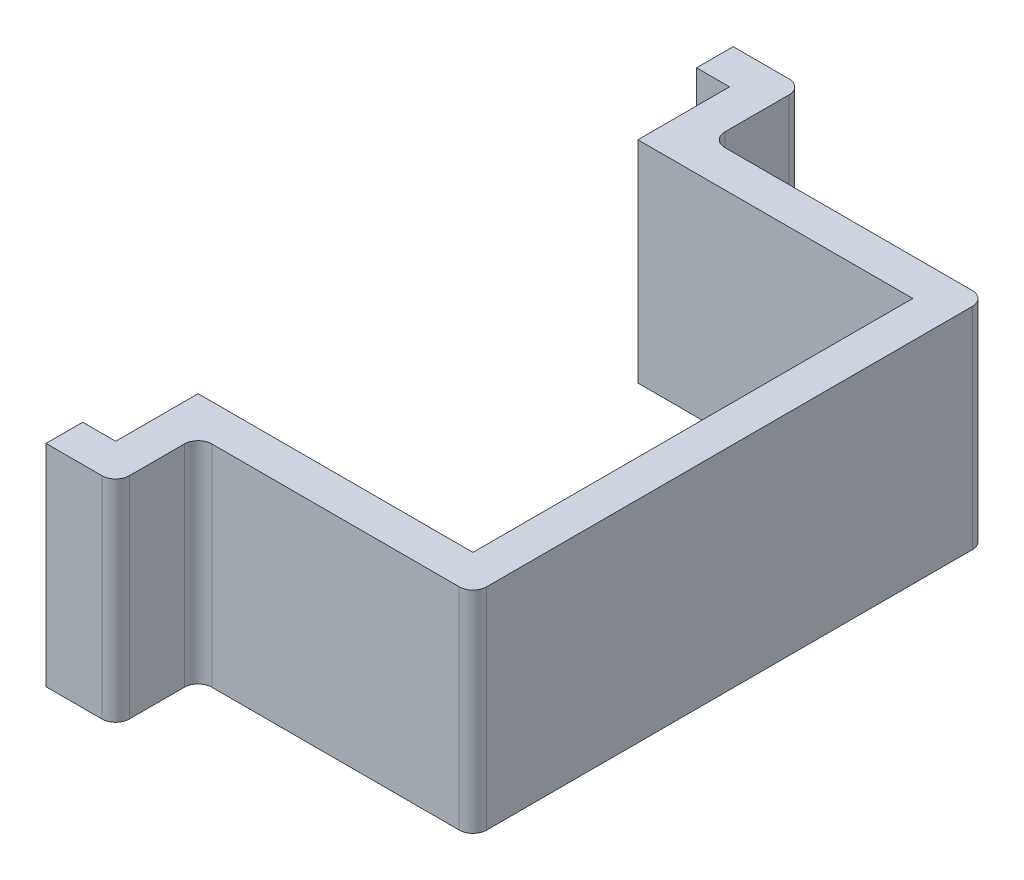
ISO-10303-21;
HEADER;
FILE_DESCRIPTION(('STEP AP214'),'2;1');
FILE_NAME('part.step','',(''),(''),'','','');
FILE_SCHEMA(('AUTOMOTIVE_DESIGN { 1 0 10303 214 1 1 1 1 }'));
ENDSEC;
DATA;
#1=APPLICATION_CONTEXT('core data for automotive mechanical design processes');
#2=APPLICATION_PROTOCOL_DEFINITION('international standard','automotive_design',2000,#1);
#3=PRODUCT_CONTEXT('',#1,'mechanical');
#4=PRODUCT('Part','Part','',(#3));
#5=PRODUCT_RELATED_PRODUCT_CATEGORY('part','',(#4));
#6=PRODUCT_DEFINITION_FORMATION('','',#4);
#7=PRODUCT_DEFINITION_CONTEXT('part definition',#1,'design');
#8=PRODUCT_DEFINITION('design','',#6,#7);
#9=PRODUCT_DEFINITION_SHAPE('','',#8);
#10=(LENGTH_UNIT() NAMED_UNIT(*) SI_UNIT(.MILLI.,.METRE.));
#11=(NAMED_UNIT(*) PLANE_ANGLE_UNIT() SI_UNIT($,.RADIAN.));
#12=(NAMED_UNIT(*) SI_UNIT($,.STERADIAN.) SOLID_ANGLE_UNIT());
#13=UNCERTAINTY_MEASURE_WITH_UNIT(LENGTH_MEASURE(1.E-05),#10,'distance_accuracy_value','');
#14=(GEOMETRIC_REPRESENTATION_CONTEXT(3) GLOBAL_UNCERTAINTY_ASSIGNED_CONTEXT((#13)) GLOBAL_UNIT_ASSIGNED_CONTEXT((#10,
#11,#12)) REPRESENTATION_CONTEXT('',''));
#15=CARTESIAN_POINT('',(0.,0.,0.));
#16=DIRECTION('',(0.,0.,1.));
#17=DIRECTION('',(1.,0.,0.));
#18=AXIS2_PLACEMENT_3D('',#15,#16,#17);
#19=CARTESIAN_POINT('',(6.4,11.5,6.25));
#20=DIRECTION('',(0.,-1.,0.));
#21=DIRECTION('',(0.,0.,-1.));
#22=AXIS2_PLACEMENT_3D('',#19,#20,#21);
#23=CYLINDRICAL_SURFACE('',#22,0.75);
#24=CARTESIAN_POINT('',(6.4,0.,6.25));
#25=DIRECTION('',(0.,1.,0.));
#26=DIRECTION('',(0.,0.,1.));
#27=AXIS2_PLACEMENT_3D('',#24,#25,#26);
#28=CIRCLE('',#27,0.75);
#29=CARTESIAN_POINT('',(7.15,0.,6.24999999999999));
#30=VERTEX_POINT('',#29);
#31=CARTESIAN_POINT('',(6.39999999999999,0.,7.));
#32=VERTEX_POINT('',#31);
#33=EDGE_CURVE('E219',#30,#32,#28,.F.);
#34=ORIENTED_EDGE('',*,*,#33,.F.);
#35=DIRECTION('',(0.,-1.,0.));
#36=VECTOR('',#35,1.);
#37=CARTESIAN_POINT('',(7.15,11.5,6.24999999999999));
#38=LINE('',#37,#36);
#39=CARTESIAN_POINT('',(7.15,11.5,6.24999999999999));
#40=VERTEX_POINT('',#39);
#41=EDGE_CURVE('E11',#40,#30,#38,.T.);
#42=ORIENTED_EDGE('',*,*,#41,.F.);
#43=CARTESIAN_POINT('',(6.4,11.5,6.25));
#44=DIRECTION('',(0.,1.,0.));
#45=DIRECTION('',(0.,0.,1.));
#46=AXIS2_PLACEMENT_3D('',#43,#44,#45);
#47=CIRCLE('',#46,0.75);
#48=CARTESIAN_POINT('',(6.39999999999999,11.5,7.));
#49=VERTEX_POINT('',#48);
#50=EDGE_CURVE('E277',#40,#49,#47,.F.);
#51=ORIENTED_EDGE('',*,*,#50,.T.);
#52=DIRECTION('',(0.,-1.,0.));
#53=VECTOR('',#52,1.);
#54=CARTESIAN_POINT('',(6.39999999999999,11.5,7.));
#55=LINE('',#54,#53);
#56=EDGE_CURVE('E57',#49,#32,#55,.T.);
#57=ORIENTED_EDGE('',*,*,#56,.T.);
#58=EDGE_LOOP('',(#34,#42,#51,#57));
#59=FACE_BOUND('',#58,.T.);
#60=ADVANCED_FACE('F41',(#59),#23,.T.);
#61=CARTESIAN_POINT('',(7.15,11.5,0.));
#62=DIRECTION('',(1.,0.,0.));
#63=DIRECTION('',(0.,0.,-1.));
#64=AXIS2_PLACEMENT_3D('',#61,#62,#63);
#65=PLANE('',#64);
#66=DIRECTION('',(0.,0.,1.));
#67=VECTOR('',#66,1.);
#68=CARTESIAN_POINT('',(7.15,0.,0.));
#69=LINE('',#68,#67);
#70=CARTESIAN_POINT('',(7.15,0.,3.25000000000001));
#71=VERTEX_POINT('',#70);
#72=EDGE_CURVE('E221',#71,#30,#69,.T.);
#73=ORIENTED_EDGE('',*,*,#72,.F.);
#74=DIRECTION('',(0.,-1.,0.));
#75=VECTOR('',#74,1.);
#76=CARTESIAN_POINT('',(7.15,11.5,3.25000000000001));
#77=LINE('',#76,#75);
#78=CARTESIAN_POINT('',(7.15,11.5,3.25000000000001));
#79=VERTEX_POINT('',#78);
#80=EDGE_CURVE('E49',#79,#71,#77,.T.);
#81=ORIENTED_EDGE('',*,*,#80,.F.);
#82=DIRECTION('',(0.,0.,1.));
#83=VECTOR('',#82,1.);
#84=CARTESIAN_POINT('',(7.15,11.5,0.));
#85=LINE('',#84,#83);
#86=EDGE_CURVE('E340',#79,#40,#85,.T.);
#87=ORIENTED_EDGE('',*,*,#86,.T.);
#88=ORIENTED_EDGE('',*,*,#41,.T.);
#89=EDGE_LOOP('',(#73,#81,#87,#88));
#90=FACE_BOUND('',#89,.T.);
#91=ADVANCED_FACE('F325',(#90),#65,.T.);
#92=CARTESIAN_POINT('',(7.9,11.5,3.25));
#93=DIRECTION('',(0.,-1.,0.));
#94=DIRECTION('',(0.,0.,-1.));
#95=AXIS2_PLACEMENT_3D('',#92,#93,#94);
#96=CYLINDRICAL_SURFACE('',#95,0.75);
#97=CARTESIAN_POINT('',(7.9,0.,3.25));
#98=DIRECTION('',(0.,1.,0.));
#99=DIRECTION('',(0.,0.,1.));
#100=AXIS2_PLACEMENT_3D('',#97,#98,#99);
#101=CIRCLE('',#100,0.75);
#102=CARTESIAN_POINT('',(7.9,0.,2.5));
#103=VERTEX_POINT('',#102);
#104=EDGE_CURVE('E224',#103,#71,#101,.T.);
#105=ORIENTED_EDGE('',*,*,#104,.F.);
#106=DIRECTION('',(0.,-1.,0.));
#107=VECTOR('',#106,1.);
#108=CARTESIAN_POINT('',(7.9,11.5,2.5));
#109=LINE('',#108,#107);
#110=CARTESIAN_POINT('',(7.9,11.5,2.5));
#111=VERTEX_POINT('',#110);
#112=EDGE_CURVE('E314',#111,#103,#109,.T.);
#113=ORIENTED_EDGE('',*,*,#112,.F.);
#114=CARTESIAN_POINT('',(7.9,11.5,3.25));
#115=DIRECTION('',(0.,1.,0.));
#116=DIRECTION('',(0.,0.,1.));
#117=AXIS2_PLACEMENT_3D('',#114,#115,#116);
#118=CIRCLE('',#117,0.75);
#119=EDGE_CURVE('E321',#111,#79,#118,.T.);
#120=ORIENTED_EDGE('',*,*,#119,.T.);
#121=ORIENTED_EDGE('',*,*,#80,.T.);
#122=EDGE_LOOP('',(#105,#113,#120,#121));
#123=FACE_BOUND('',#122,.T.);
#124=ADVANCED_FACE('F319',(#123),#96,.F.);
#125=CARTESIAN_POINT('',(0.,11.5,2.5));
#126=DIRECTION('',(0.,0.,-1.));
#127=DIRECTION('',(-1.,0.,0.));
#128=AXIS2_PLACEMENT_3D('',#125,#126,#127);
#129=PLANE('',#128);
#130=DIRECTION('',(1.,0.,0.));
#131=VECTOR('',#130,1.);
#132=CARTESIAN_POINT('',(0.,0.,2.5));
#133=LINE('',#132,#131);
#134=CARTESIAN_POINT('',(21.4,0.,2.5));
#135=VERTEX_POINT('',#134);
#136=EDGE_CURVE('E227',#103,#135,#133,.T.);
#137=ORIENTED_EDGE('',*,*,#136,.T.);
#138=DIRECTION('',(0.,-1.,0.));
#139=VECTOR('',#138,1.);
#140=CARTESIAN_POINT('',(21.4,11.5,2.5));
#141=LINE('',#140,#139);
#142=CARTESIAN_POINT('',(21.4,11.5,2.5));
#143=VERTEX_POINT('',#142);
#144=EDGE_CURVE('E312',#143,#135,#141,.T.);
#145=ORIENTED_EDGE('',*,*,#144,.F.);
#146=DIRECTION('',(1.,0.,0.));
#147=VECTOR('',#146,1.);
#148=CARTESIAN_POINT('',(0.,11.5,2.5));
#149=LINE('',#148,#147);
#150=EDGE_CURVE('E336',#111,#143,#149,.T.);
#151=ORIENTED_EDGE('',*,*,#150,.F.);
#152=ORIENTED_EDGE('',*,*,#112,.T.);
#153=EDGE_LOOP('',(#137,#145,#151,#152));
#154=FACE_BOUND('',#153,.T.);
#155=ADVANCED_FACE('F333',(#154),#129,.F.);
#156=CARTESIAN_POINT('',(21.4,11.5,1.75));
#157=DIRECTION('',(0.,-1.,0.));
#158=DIRECTION('',(0.,0.,-1.));
#159=AXIS2_PLACEMENT_3D('',#156,#157,#158);
#160=CYLINDRICAL_SURFACE('',#159,0.75);
#161=CARTESIAN_POINT('',(21.4,0.,1.75));
#162=DIRECTION('',(0.,1.,0.));
#163=DIRECTION('',(0.,0.,1.));
#164=AXIS2_PLACEMENT_3D('',#161,#162,#163);
#165=CIRCLE('',#164,0.75);
#166=CARTESIAN_POINT('',(22.15,0.,1.74999999999999));
#167=VERTEX_POINT('',#166);
#168=EDGE_CURVE('E230',#167,#135,#165,.F.);
#169=ORIENTED_EDGE('',*,*,#168,.F.);
#170=DIRECTION('',(0.,-1.,0.));
#171=VECTOR('',#170,1.);
#172=CARTESIAN_POINT('',(22.15,11.5,1.74999999999999));
#173=LINE('',#172,#171);
#174=CARTESIAN_POINT('',(22.15,11.5,1.74999999999999));
#175=VERTEX_POINT('',#174);
#176=EDGE_CURVE('E310',#175,#167,#173,.T.);
#177=ORIENTED_EDGE('',*,*,#176,.F.);
#178=CARTESIAN_POINT('',(21.4,11.5,1.75));
#179=DIRECTION('',(0.,1.,0.));
#180=DIRECTION('',(0.,0.,1.));
#181=AXIS2_PLACEMENT_3D('',#178,#179,#180);
#182=CIRCLE('',#181,0.75);
#183=EDGE_CURVE('E338',#175,#143,#182,.F.);
#184=ORIENTED_EDGE('',*,*,#183,.T.);
#185=ORIENTED_EDGE('',*,*,#144,.T.);
#186=EDGE_LOOP('',(#169,#177,#184,#185));
#187=FACE_BOUND('',#186,.T.);
#188=ADVANCED_FACE('F576',(#187),#160,.T.);
#189=CARTESIAN_POINT('',(22.15,11.5,0.));
#190=DIRECTION('',(-1.,0.,0.));
#191=DIRECTION('',(0.,0.,1.));
#192=AXIS2_PLACEMENT_3D('',#189,#190,#191);
#193=PLANE('',#192);
#194=DIRECTION('',(0.,0.,-1.));
#195=VECTOR('',#194,1.);
#196=CARTESIAN_POINT('',(22.15,0.,0.));
#197=LINE('',#196,#195);
#198=CARTESIAN_POINT('',(22.15,0.,-24.75));
#199=VERTEX_POINT('',#198);
#200=EDGE_CURVE('E233',#167,#199,#197,.T.);
#201=ORIENTED_EDGE('',*,*,#200,.T.);
#202=DIRECTION('',(0.,-1.,0.));
#203=VECTOR('',#202,1.);
#204=CARTESIAN_POINT('',(22.15,11.5,-24.75));
#205=LINE('',#204,#203);
#206=CARTESIAN_POINT('',(22.15,11.5,-24.75));
#207=VERTEX_POINT('',#206);
#208=EDGE_CURVE('E308',#207,#199,#205,.T.);
#209=ORIENTED_EDGE('',*,*,#208,.F.);
#210=DIRECTION('',(0.,0.,-1.));
#211=VECTOR('',#210,1.);
#212=CARTESIAN_POINT('',(22.15,11.5,0.));
#213=LINE('',#212,#211);
#214=EDGE_CURVE('E346',#175,#207,#213,.T.);
#215=ORIENTED_EDGE('',*,*,#214,.F.);
#216=ORIENTED_EDGE('',*,*,#176,.T.);
#217=EDGE_LOOP('',(#201,#209,#215,#216));
#218=FACE_BOUND('',#217,.T.);
#219=ADVANCED_FACE('F567',(#218),#193,.F.);
#220=CARTESIAN_POINT('',(21.4,11.5,-24.75));
#221=DIRECTION('',(0.,-1.,0.));
#222=DIRECTION('',(0.,0.,-1.));
#223=AXIS2_PLACEMENT_3D('',#220,#221,#222);
#224=CYLINDRICAL_SURFACE('',#223,0.750000000000001);
#225=CARTESIAN_POINT('',(21.4,0.,-24.75));
#226=DIRECTION('',(0.,1.,0.));
#227=DIRECTION('',(0.,0.,1.));
#228=AXIS2_PLACEMENT_3D('',#225,#226,#227);
#229=CIRCLE('',#228,0.750000000000001);
#230=CARTESIAN_POINT('',(21.4,0.,-25.5));
#231=VERTEX_POINT('',#230);
#232=EDGE_CURVE('E236',#231,#199,#229,.F.);
#233=ORIENTED_EDGE('',*,*,#232,.F.);
#234=DIRECTION('',(0.,-1.,0.));
#235=VECTOR('',#234,1.);
#236=CARTESIAN_POINT('',(21.4,11.5,-25.5));
#237=LINE('',#236,#235);
#238=CARTESIAN_POINT('',(21.4,11.5,-25.5));
#239=VERTEX_POINT('',#238);
#240=EDGE_CURVE('E306',#239,#231,#237,.T.);
#241=ORIENTED_EDGE('',*,*,#240,.F.);
#242=CARTESIAN_POINT('',(21.4,11.5,-24.75));
#243=DIRECTION('',(0.,1.,0.));
#244=DIRECTION('',(0.,0.,1.));
#245=AXIS2_PLACEMENT_3D('',#242,#243,#244);
#246=CIRCLE('',#245,0.750000000000001);
#247=EDGE_CURVE('E348',#239,#207,#246,.F.);
#248=ORIENTED_EDGE('',*,*,#247,.T.);
#249=ORIENTED_EDGE('',*,*,#208,.T.);
#250=EDGE_LOOP('',(#233,#241,#248,#249));
#251=FACE_BOUND('',#250,.T.);
#252=ADVANCED_FACE('F558',(#251),#224,.T.);
#253=CARTESIAN_POINT('',(0.,11.5,-25.5));
#254=DIRECTION('',(0.,0.,-1.));
#255=DIRECTION('',(-1.,0.,0.));
#256=AXIS2_PLACEMENT_3D('',#253,#254,#255);
#257=PLANE('',#256);
#258=DIRECTION('',(1.,0.,0.));
#259=VECTOR('',#258,1.);
#260=CARTESIAN_POINT('',(0.,0.,-25.5));
#261=LINE('',#260,#259);
#262=CARTESIAN_POINT('',(7.9,0.,-25.5));
#263=VERTEX_POINT('',#262);
#264=EDGE_CURVE('E239',#263,#231,#261,.T.);
#265=ORIENTED_EDGE('',*,*,#264,.F.);
#266=DIRECTION('',(0.,-1.,0.));
#267=VECTOR('',#266,1.);
#268=CARTESIAN_POINT('',(7.9,11.5,-25.5));
#269=LINE('',#268,#267);
#270=CARTESIAN_POINT('',(7.9,11.5,-25.5));
#271=VERTEX_POINT('',#270);
#272=EDGE_CURVE('E304',#271,#263,#269,.T.);
#273=ORIENTED_EDGE('',*,*,#272,.F.);
#274=DIRECTION('',(1.,0.,0.));
#275=VECTOR('',#274,1.);
#276=CARTESIAN_POINT('',(0.,11.5,-25.5));
#277=LINE('',#276,#275);
#278=EDGE_CURVE('E351',#271,#239,#277,.T.);
#279=ORIENTED_EDGE('',*,*,#278,.T.);
#280=ORIENTED_EDGE('',*,*,#240,.T.);
#281=EDGE_LOOP('',(#265,#273,#279,#280));
#282=FACE_BOUND('',#281,.T.);
#283=ADVANCED_FACE('F549',(#282),#257,.T.);
#284=CARTESIAN_POINT('',(7.89999999999999,11.5,-26.25));
#285=DIRECTION('',(0.,-1.,0.));
#286=DIRECTION('',(0.,0.,-1.));
#287=AXIS2_PLACEMENT_3D('',#284,#285,#286);
#288=CYLINDRICAL_SURFACE('',#287,0.750000000000001);
#289=CARTESIAN_POINT('',(7.89999999999999,0.,-26.25));
#290=DIRECTION('',(0.,1.,0.));
#291=DIRECTION('',(0.,0.,1.));
#292=AXIS2_PLACEMENT_3D('',#289,#290,#291);
#293=CIRCLE('',#292,0.750000000000001);
#294=CARTESIAN_POINT('',(7.14999999999999,0.,-26.25));
#295=VERTEX_POINT('',#294);
#296=EDGE_CURVE('E242',#295,#263,#293,.T.);
#297=ORIENTED_EDGE('',*,*,#296,.F.);
#298=DIRECTION('',(0.,-1.,0.));
#299=VECTOR('',#298,1.);
#300=CARTESIAN_POINT('',(7.14999999999999,11.5,-26.25));
#301=LINE('',#300,#299);
#302=CARTESIAN_POINT('',(7.14999999999999,11.5,-26.25));
#303=VERTEX_POINT('',#302);
#304=EDGE_CURVE('E302',#303,#295,#301,.T.);
#305=ORIENTED_EDGE('',*,*,#304,.F.);
#306=CARTESIAN_POINT('',(7.89999999999999,11.5,-26.25));
#307=DIRECTION('',(0.,1.,0.));
#308=DIRECTION('',(0.,0.,1.));
#309=AXIS2_PLACEMENT_3D('',#306,#307,#308);
#310=CIRCLE('',#309,0.750000000000001);
#311=EDGE_CURVE('E354',#303,#271,#310,.T.);
#312=ORIENTED_EDGE('',*,*,#311,.T.);
#313=ORIENTED_EDGE('',*,*,#272,.T.);
#314=EDGE_LOOP('',(#297,#305,#312,#313));
#315=FACE_BOUND('',#314,.T.);
#316=ADVANCED_FACE('F540',(#315),#288,.F.);
#317=CARTESIAN_POINT('',(7.14999999999999,11.5,0.));
#318=DIRECTION('',(1.,0.,0.));
#319=DIRECTION('',(0.,0.,-1.));
#320=AXIS2_PLACEMENT_3D('',#317,#318,#319);
#321=PLANE('',#320);
#322=DIRECTION('',(0.,0.,1.));
#323=VECTOR('',#322,1.);
#324=CARTESIAN_POINT('',(7.14999999999999,0.,0.));
#325=LINE('',#324,#323);
#326=CARTESIAN_POINT('',(7.14999999999999,0.,-29.75));
#327=VERTEX_POINT('',#326);
#328=EDGE_CURVE('E245',#327,#295,#325,.T.);
#329=ORIENTED_EDGE('',*,*,#328,.F.);
#330=DIRECTION('',(0.,-1.,0.));
#331=VECTOR('',#330,1.);
#332=CARTESIAN_POINT('',(7.14999999999999,11.5,-29.75));
#333=LINE('',#332,#331);
#334=CARTESIAN_POINT('',(7.14999999999999,11.5,-29.75));
#335=VERTEX_POINT('',#334);
#336=EDGE_CURVE('E300',#335,#327,#333,.T.);
#337=ORIENTED_EDGE('',*,*,#336,.F.);
#338=DIRECTION('',(0.,0.,1.));
#339=VECTOR('',#338,1.);
#340=CARTESIAN_POINT('',(7.14999999999999,11.5,0.));
#341=LINE('',#340,#339);
#342=EDGE_CURVE('E357',#335,#303,#341,.T.);
#343=ORIENTED_EDGE('',*,*,#342,.T.);
#344=ORIENTED_EDGE('',*,*,#304,.T.);
#345=EDGE_LOOP('',(#329,#337,#343,#344));
#346=FACE_BOUND('',#345,.T.);
#347=ADVANCED_FACE('F530',(#346),#321,.T.);
#348=CARTESIAN_POINT('',(6.39999999999999,11.5,-29.75));
#349=DIRECTION('',(0.,-1.,0.));
#350=DIRECTION('',(0.,0.,-1.));
#351=AXIS2_PLACEMENT_3D('',#348,#349,#350);
#352=CYLINDRICAL_SURFACE('',#351,0.750000000000001);
#353=CARTESIAN_POINT('',(6.39999999999999,0.,-29.75));
#354=DIRECTION('',(0.,1.,0.));
#355=DIRECTION('',(0.,0.,1.));
#356=AXIS2_PLACEMENT_3D('',#353,#354,#355);
#357=CIRCLE('',#356,0.750000000000001);
#358=CARTESIAN_POINT('',(6.39999999999998,0.,-30.5));
#359=VERTEX_POINT('',#358);
#360=EDGE_CURVE('E248',#327,#359,#357,.T.);
#361=ORIENTED_EDGE('',*,*,#360,.T.);
#362=DIRECTION('',(0.,-1.,0.));
#363=VECTOR('',#362,1.);
#364=CARTESIAN_POINT('',(6.39999999999998,11.5,-30.5));
#365=LINE('',#364,#363);
#366=CARTESIAN_POINT('',(6.39999999999998,11.5,-30.5));
#367=VERTEX_POINT('',#366);
#368=EDGE_CURVE('E297',#367,#359,#365,.T.);
#369=ORIENTED_EDGE('',*,*,#368,.F.);
#370=CARTESIAN_POINT('',(6.39999999999999,11.5,-29.75));
#371=DIRECTION('',(0.,1.,0.));
#372=DIRECTION('',(0.,0.,1.));
#373=AXIS2_PLACEMENT_3D('',#370,#371,#372);
#374=CIRCLE('',#373,0.750000000000001);
#375=EDGE_CURVE('E360',#335,#367,#374,.T.);
#376=ORIENTED_EDGE('',*,*,#375,.F.);
#377=ORIENTED_EDGE('',*,*,#336,.T.);
#378=EDGE_LOOP('',(#361,#369,#376,#377));
#379=FACE_BOUND('',#378,.T.);
#380=ADVANCED_FACE('F521',(#379),#352,.T.);
#381=CARTESIAN_POINT('',(0.,11.5,-30.5));
#382=DIRECTION('',(0.,0.,1.));
#383=DIRECTION('',(1.,0.,0.));
#384=AXIS2_PLACEMENT_3D('',#381,#382,#383);
#385=PLANE('',#384);
#386=DIRECTION('',(-1.,0.,0.));
#387=VECTOR('',#386,1.);
#388=CARTESIAN_POINT('',(0.,0.,-30.5));
#389=LINE('',#388,#387);
#390=CARTESIAN_POINT('',(3.35,0.,-30.5));
#391=VERTEX_POINT('',#390);
#392=EDGE_CURVE('E250',#359,#391,#389,.T.);
#393=ORIENTED_EDGE('',*,*,#392,.T.);
#394=DIRECTION('',(0.,-1.,0.));
#395=VECTOR('',#394,1.);
#396=CARTESIAN_POINT('',(3.35,11.5,-30.5));
#397=LINE('',#396,#395);
#398=CARTESIAN_POINT('',(3.35,11.5,-30.5));
#399=VERTEX_POINT('',#398);
#400=EDGE_CURVE('E294',#399,#391,#397,.T.);
#401=ORIENTED_EDGE('',*,*,#400,.F.);
#402=DIRECTION('',(-1.,0.,0.));
#403=VECTOR('',#402,1.);
#404=CARTESIAN_POINT('',(0.,11.5,-30.5));
#405=LINE('',#404,#403);
#406=EDGE_CURVE('E362',#367,#399,#405,.T.);
#407=ORIENTED_EDGE('',*,*,#406,.F.);
#408=ORIENTED_EDGE('',*,*,#368,.T.);
#409=EDGE_LOOP('',(#393,#401,#407,#408));
#410=FACE_BOUND('',#409,.T.);
#411=ADVANCED_FACE('F512',(#410),#385,.F.);
#412=CARTESIAN_POINT('',(3.35,11.5,0.));
#413=DIRECTION('',(1.,0.,0.));
#414=DIRECTION('',(0.,0.,-1.));
#415=AXIS2_PLACEMENT_3D('',#412,#413,#414);
#416=PLANE('',#415);
#417=DIRECTION('',(0.,0.,1.));
#418=VECTOR('',#417,1.);
#419=CARTESIAN_POINT('',(3.35,0.,0.));
#420=LINE('',#419,#418);
#421=CARTESIAN_POINT('',(3.35,0.,-28.5));
#422=VERTEX_POINT('',#421);
#423=EDGE_CURVE('E252',#391,#422,#420,.T.);
#424=ORIENTED_EDGE('',*,*,#423,.T.);
#425=DIRECTION('',(0.,-1.,0.));
#426=VECTOR('',#425,1.);
#427=CARTESIAN_POINT('',(3.35,11.5,-28.5));
#428=LINE('',#427,#426);
#429=CARTESIAN_POINT('',(3.35,11.5,-28.5));
#430=VERTEX_POINT('',#429);
#431=EDGE_CURVE('E291',#430,#422,#428,.T.);
#432=ORIENTED_EDGE('',*,*,#431,.F.);
#433=DIRECTION('',(0.,0.,1.));
#434=VECTOR('',#433,1.);
#435=CARTESIAN_POINT('',(3.35,11.5,0.));
#436=LINE('',#435,#434);
#437=EDGE_CURVE('E364',#399,#430,#436,.T.);
#438=ORIENTED_EDGE('',*,*,#437,.F.);
#439=ORIENTED_EDGE('',*,*,#400,.T.);
#440=EDGE_LOOP('',(#424,#432,#438,#439));
#441=FACE_BOUND('',#440,.T.);
#442=ADVANCED_FACE('F502',(#441),#416,.F.);
#443=CARTESIAN_POINT('',(0.,11.5,-28.5));
#444=DIRECTION('',(0.,0.,-1.));
#445=DIRECTION('',(-1.,0.,0.));
#446=AXIS2_PLACEMENT_3D('',#443,#444,#445);
#447=PLANE('',#446);
#448=DIRECTION('',(1.,0.,0.));
#449=VECTOR('',#448,1.);
#450=CARTESIAN_POINT('',(0.,0.,-28.5));
#451=LINE('',#450,#449);
#452=CARTESIAN_POINT('',(5.14999999999999,0.,-28.5));
#453=VERTEX_POINT('',#452);
#454=EDGE_CURVE('E254',#422,#453,#451,.T.);
#455=ORIENTED_EDGE('',*,*,#454,.T.);
#456=DIRECTION('',(0.,-1.,0.));
#457=VECTOR('',#456,1.);
#458=CARTESIAN_POINT('',(5.14999999999999,11.5,-28.5));
#459=LINE('',#458,#457);
#460=CARTESIAN_POINT('',(5.14999999999999,11.5,-28.5));
#461=VERTEX_POINT('',#460);
#462=EDGE_CURVE('E289',#461,#453,#459,.T.);
#463=ORIENTED_EDGE('',*,*,#462,.F.);
#464=DIRECTION('',(1.,0.,0.));
#465=VECTOR('',#464,1.);
#466=CARTESIAN_POINT('',(0.,11.5,-28.5));
#467=LINE('',#466,#465);
#468=EDGE_CURVE('E366',#430,#461,#467,.T.);
#469=ORIENTED_EDGE('',*,*,#468,.F.);
#470=ORIENTED_EDGE('',*,*,#431,.T.);
#471=EDGE_LOOP('',(#455,#463,#469,#470));
#472=FACE_BOUND('',#471,.T.);
#473=ADVANCED_FACE('F491',(#472),#447,.F.);
#474=CARTESIAN_POINT('',(5.15000000000044,11.5,0.));
#475=DIRECTION('',(-1.,0.,0.));
#476=DIRECTION('',(0.,0.,1.));
#477=AXIS2_PLACEMENT_3D('',#474,#475,#476);
#478=PLANE('',#477);
#479=DIRECTION('',(0.,0.,-1.));
#480=VECTOR('',#479,1.);
#481=CARTESIAN_POINT('',(5.15000000000044,0.,0.));
#482=LINE('',#481,#480);
#483=CARTESIAN_POINT('',(5.14999999999999,0.,-23.5));
#484=VERTEX_POINT('',#483);
#485=EDGE_CURVE('E257',#484,#453,#482,.T.);
#486=ORIENTED_EDGE('',*,*,#485,.F.);
#487=DIRECTION('',(0.,-1.,0.));
#488=VECTOR('',#487,1.);
#489=CARTESIAN_POINT('',(5.14999999999999,11.5,-23.5));
#490=LINE('',#489,#488);
#491=CARTESIAN_POINT('',(5.14999999999999,11.5,-23.5));
#492=VERTEX_POINT('',#491);
#493=EDGE_CURVE('E287',#492,#484,#490,.T.);
#494=ORIENTED_EDGE('',*,*,#493,.F.);
#495=DIRECTION('',(0.,0.,-1.));
#496=VECTOR('',#495,1.);
#497=CARTESIAN_POINT('',(5.15000000000044,11.5,0.));
#498=LINE('',#497,#496);
#499=EDGE_CURVE('E368',#492,#461,#498,.T.);
#500=ORIENTED_EDGE('',*,*,#499,.T.);
#501=ORIENTED_EDGE('',*,*,#462,.T.);
#502=EDGE_LOOP('',(#486,#494,#500,#501));
#503=FACE_BOUND('',#502,.T.);
#504=ADVANCED_FACE('F481',(#503),#478,.T.);
#505=CARTESIAN_POINT('',(0.,11.5,-23.5));
#506=DIRECTION('',(0.,0.,-1.));
#507=DIRECTION('',(-1.,0.,0.));
#508=AXIS2_PLACEMENT_3D('',#505,#506,#507);
#509=PLANE('',#508);
#510=DIRECTION('',(1.,0.,0.));
#511=VECTOR('',#510,1.);
#512=CARTESIAN_POINT('',(0.,0.,-23.5));
#513=LINE('',#512,#511);
#514=CARTESIAN_POINT('',(20.15,0.,-23.5));
#515=VERTEX_POINT('',#514);
#516=EDGE_CURVE('E260',#484,#515,#513,.T.);
#517=ORIENTED_EDGE('',*,*,#516,.T.);
#518=DIRECTION('',(0.,-1.,0.));
#519=VECTOR('',#518,1.);
#520=CARTESIAN_POINT('',(20.15,11.5,-23.5));
#521=LINE('',#520,#519);
#522=CARTESIAN_POINT('',(20.15,11.5,-23.5));
#523=VERTEX_POINT('',#522);
#524=EDGE_CURVE('E285',#523,#515,#521,.T.);
#525=ORIENTED_EDGE('',*,*,#524,.F.);
#526=DIRECTION('',(1.,0.,0.));
#527=VECTOR('',#526,1.);
#528=CARTESIAN_POINT('',(0.,11.5,-23.5));
#529=LINE('',#528,#527);
#530=EDGE_CURVE('E371',#492,#523,#529,.T.);
#531=ORIENTED_EDGE('',*,*,#530,.F.);
#532=ORIENTED_EDGE('',*,*,#493,.T.);
#533=EDGE_LOOP('',(#517,#525,#531,#532));
#534=FACE_BOUND('',#533,.T.);
#535=ADVANCED_FACE('F472',(#534),#509,.F.);
#536=CARTESIAN_POINT('',(20.15,11.5,0.));
#537=DIRECTION('',(-1.,0.,0.));
#538=DIRECTION('',(0.,0.,1.));
#539=AXIS2_PLACEMENT_3D('',#536,#537,#538);
#540=PLANE('',#539);
#541=DIRECTION('',(0.,0.,-1.));
#542=VECTOR('',#541,1.);
#543=CARTESIAN_POINT('',(20.15,0.,0.));
#544=LINE('',#543,#542);
#545=CARTESIAN_POINT('',(20.15,0.,0.5));
#546=VERTEX_POINT('',#545);
#547=EDGE_CURVE('E263',#546,#515,#544,.T.);
#548=ORIENTED_EDGE('',*,*,#547,.F.);
#549=DIRECTION('',(0.,-1.,0.));
#550=VECTOR('',#549,1.);
#551=CARTESIAN_POINT('',(20.15,11.5,0.5));
#552=LINE('',#551,#550);
#553=CARTESIAN_POINT('',(20.15,11.5,0.5));
#554=VERTEX_POINT('',#553);
#555=EDGE_CURVE('E283',#554,#546,#552,.T.);
#556=ORIENTED_EDGE('',*,*,#555,.F.);
#557=DIRECTION('',(0.,0.,-1.));
#558=VECTOR('',#557,1.);
#559=CARTESIAN_POINT('',(20.15,11.5,0.));
#560=LINE('',#559,#558);
#561=EDGE_CURVE('E373',#554,#523,#560,.T.);
#562=ORIENTED_EDGE('',*,*,#561,.T.);
#563=ORIENTED_EDGE('',*,*,#524,.T.);
#564=EDGE_LOOP('',(#548,#556,#562,#563));
#565=FACE_BOUND('',#564,.T.);
#566=ADVANCED_FACE('F387',(#565),#540,.T.);
#567=CARTESIAN_POINT('',(0.,11.5,0.5));
#568=DIRECTION('',(0.,0.,-1.));
#569=DIRECTION('',(-1.,0.,0.));
#570=AXIS2_PLACEMENT_3D('',#567,#568,#569);
#571=PLANE('',#570);
#572=DIRECTION('',(1.,0.,0.));
#573=VECTOR('',#572,1.);
#574=CARTESIAN_POINT('',(0.,0.,0.5));
#575=LINE('',#574,#573);
#576=CARTESIAN_POINT('',(5.15,0.,0.5));
#577=VERTEX_POINT('',#576);
#578=EDGE_CURVE('E266',#577,#546,#575,.T.);
#579=ORIENTED_EDGE('',*,*,#578,.F.);
#580=DIRECTION('',(0.,-1.,0.));
#581=VECTOR('',#580,1.);
#582=CARTESIAN_POINT('',(5.15,11.5,0.5));
#583=LINE('',#582,#581);
#584=CARTESIAN_POINT('',(5.15,11.5,0.5));
#585=VERTEX_POINT('',#584);
#586=EDGE_CURVE('E281',#585,#577,#583,.T.);
#587=ORIENTED_EDGE('',*,*,#586,.F.);
#588=DIRECTION('',(1.,0.,0.));
#589=VECTOR('',#588,1.);
#590=CARTESIAN_POINT('',(0.,11.5,0.5));
#591=LINE('',#590,#589);
#592=EDGE_CURVE('E376',#585,#554,#591,.T.);
#593=ORIENTED_EDGE('',*,*,#592,.T.);
#594=ORIENTED_EDGE('',*,*,#555,.T.);
#595=EDGE_LOOP('',(#579,#587,#593,#594));
#596=FACE_BOUND('',#595,.T.);
#597=ADVANCED_FACE('F380',(#596),#571,.T.);
#598=CARTESIAN_POINT('',(5.15,11.5,0.));
#599=DIRECTION('',(1.,0.,0.));
#600=DIRECTION('',(0.,0.,-1.));
#601=AXIS2_PLACEMENT_3D('',#598,#599,#600);
#602=PLANE('',#601);
#603=DIRECTION('',(0.,0.,1.));
#604=VECTOR('',#603,1.);
#605=CARTESIAN_POINT('',(5.15,0.,0.));
#606=LINE('',#605,#604);
#607=CARTESIAN_POINT('',(5.15,0.,5.));
#608=VERTEX_POINT('',#607);
#609=EDGE_CURVE('E269',#577,#608,#606,.T.);
#610=ORIENTED_EDGE('',*,*,#609,.T.);
#611=DIRECTION('',(0.,-1.,0.));
#612=VECTOR('',#611,1.);
#613=CARTESIAN_POINT('',(5.15,11.5,5.));
#614=LINE('',#613,#612);
#615=CARTESIAN_POINT('',(5.15,11.5,5.));
#616=VERTEX_POINT('',#615);
#617=EDGE_CURVE('E211',#616,#608,#614,.T.);
#618=ORIENTED_EDGE('',*,*,#617,.F.);
#619=DIRECTION('',(0.,0.,1.));
#620=VECTOR('',#619,1.);
#621=CARTESIAN_POINT('',(5.15,11.5,0.));
#622=LINE('',#621,#620);
#623=EDGE_CURVE('E199',#585,#616,#622,.T.);
#624=ORIENTED_EDGE('',*,*,#623,.F.);
#625=ORIENTED_EDGE('',*,*,#586,.T.);
#626=EDGE_LOOP('',(#610,#618,#624,#625));
#627=FACE_BOUND('',#626,.T.);
#628=ADVANCED_FACE('F391',(#627),#602,.F.);
#629=CARTESIAN_POINT('',(0.,11.5,5.));
#630=DIRECTION('',(0.,0.,1.));
#631=DIRECTION('',(1.,0.,0.));
#632=AXIS2_PLACEMENT_3D('',#629,#630,#631);
#633=PLANE('',#632);
#634=DIRECTION('',(-1.,0.,0.));
#635=VECTOR('',#634,1.);
#636=CARTESIAN_POINT('',(0.,0.,5.));
#637=LINE('',#636,#635);
#638=CARTESIAN_POINT('',(3.35,0.,5.));
#639=VERTEX_POINT('',#638);
#640=EDGE_CURVE('E208',#608,#639,#637,.T.);
#641=ORIENTED_EDGE('',*,*,#640,.T.);
#642=DIRECTION('',(0.,-1.,0.));
#643=VECTOR('',#642,1.);
#644=CARTESIAN_POINT('',(3.35,11.5,5.));
#645=LINE('',#644,#643);
#646=CARTESIAN_POINT('',(3.35,11.5,5.));
#647=VERTEX_POINT('',#646);
#648=EDGE_CURVE('E205',#647,#639,#645,.T.);
#649=ORIENTED_EDGE('',*,*,#648,.F.);
#650=DIRECTION('',(-1.,0.,0.));
#651=VECTOR('',#650,1.);
#652=CARTESIAN_POINT('',(0.,11.5,5.));
#653=LINE('',#652,#651);
#654=EDGE_CURVE('E191',#616,#647,#653,.T.);
#655=ORIENTED_EDGE('',*,*,#654,.F.);
#656=ORIENTED_EDGE('',*,*,#617,.T.);
#657=EDGE_LOOP('',(#641,#649,#655,#656));
#658=FACE_BOUND('',#657,.T.);
#659=ADVANCED_FACE('F206',(#658),#633,.F.);
#660=CARTESIAN_POINT('',(3.35,11.5,0.));
#661=DIRECTION('',(1.,0.,0.));
#662=DIRECTION('',(0.,0.,-1.));
#663=AXIS2_PLACEMENT_3D('',#660,#661,#662);
#664=PLANE('',#663);
#665=DIRECTION('',(0.,0.,1.));
#666=VECTOR('',#665,1.);
#667=CARTESIAN_POINT('',(3.35,0.,0.));
#668=LINE('',#667,#666);
#669=CARTESIAN_POINT('',(3.35,0.,7.));
#670=VERTEX_POINT('',#669);
#671=EDGE_CURVE('E272',#639,#670,#668,.T.);
#672=ORIENTED_EDGE('',*,*,#671,.T.);
#673=DIRECTION('',(0.,-1.,0.));
#674=VECTOR('',#673,1.);
#675=CARTESIAN_POINT('',(3.35,11.5,7.));
#676=LINE('',#675,#674);
#677=CARTESIAN_POINT('',(3.35,11.5,7.));
#678=VERTEX_POINT('',#677);
#679=EDGE_CURVE('E125',#678,#670,#676,.T.);
#680=ORIENTED_EDGE('',*,*,#679,.F.);
#681=DIRECTION('',(0.,0.,1.));
#682=VECTOR('',#681,1.);
#683=CARTESIAN_POINT('',(3.35,11.5,0.));
#684=LINE('',#683,#682);
#685=EDGE_CURVE('E196',#647,#678,#684,.T.);
#686=ORIENTED_EDGE('',*,*,#685,.F.);
#687=ORIENTED_EDGE('',*,*,#648,.T.);
#688=EDGE_LOOP('',(#672,#680,#686,#687));
#689=FACE_BOUND('',#688,.T.);
#690=ADVANCED_FACE('F213',(#689),#664,.F.);
#691=CARTESIAN_POINT('',(0.,11.5,7.));
#692=DIRECTION('',(0.,0.,1.));
#693=DIRECTION('',(1.,0.,0.));
#694=AXIS2_PLACEMENT_3D('',#691,#692,#693);
#695=PLANE('',#694);
#696=DIRECTION('',(-1.,0.,0.));
#697=VECTOR('',#696,1.);
#698=CARTESIAN_POINT('',(0.,0.,7.));
#699=LINE('',#698,#697);
#700=EDGE_CURVE('E274',#32,#670,#699,.T.);
#701=ORIENTED_EDGE('',*,*,#700,.F.);
#702=ORIENTED_EDGE('',*,*,#56,.F.);
#703=DIRECTION('',(-1.,0.,0.));
#704=VECTOR('',#703,1.);
#705=CARTESIAN_POINT('',(0.,11.5,7.));
#706=LINE('',#705,#704);
#707=EDGE_CURVE('E214',#49,#678,#706,.T.);
#708=ORIENTED_EDGE('',*,*,#707,.T.);
#709=ORIENTED_EDGE('',*,*,#679,.T.);
#710=EDGE_LOOP('',(#701,#702,#708,#709));
#711=FACE_BOUND('',#710,.T.);
#712=ADVANCED_FACE('F404',(#711),#695,.T.);
#713=CARTESIAN_POINT('',(0.,11.5,0.));
#714=DIRECTION('',(0.,1.,0.));
#715=DIRECTION('',(0.,0.,1.));
#716=AXIS2_PLACEMENT_3D('',#713,#714,#715);
#717=PLANE('',#716);
#718=ORIENTED_EDGE('',*,*,#50,.F.);
#719=ORIENTED_EDGE('',*,*,#86,.F.);
#720=ORIENTED_EDGE('',*,*,#119,.F.);
#721=ORIENTED_EDGE('',*,*,#150,.T.);
#722=ORIENTED_EDGE('',*,*,#183,.F.);
#723=ORIENTED_EDGE('',*,*,#214,.T.);
#724=ORIENTED_EDGE('',*,*,#247,.F.);
#725=ORIENTED_EDGE('',*,*,#278,.F.);
#726=ORIENTED_EDGE('',*,*,#311,.F.);
#727=ORIENTED_EDGE('',*,*,#342,.F.);
#728=ORIENTED_EDGE('',*,*,#375,.T.);
#729=ORIENTED_EDGE('',*,*,#406,.T.);
#730=ORIENTED_EDGE('',*,*,#437,.T.);
#731=ORIENTED_EDGE('',*,*,#468,.T.);
#732=ORIENTED_EDGE('',*,*,#499,.F.);
#733=ORIENTED_EDGE('',*,*,#530,.T.);
#734=ORIENTED_EDGE('',*,*,#561,.F.);
#735=ORIENTED_EDGE('',*,*,#592,.F.);
#736=ORIENTED_EDGE('',*,*,#623,.T.);
#737=ORIENTED_EDGE('',*,*,#654,.T.);
#738=ORIENTED_EDGE('',*,*,#685,.T.);
#739=ORIENTED_EDGE('',*,*,#707,.F.);
#740=EDGE_LOOP('',(#718,#719,#720,#721,#722,#723,#724,#725,#726,#727,#728,#729,#730,#731,#732,
#733,#734,#735,#736,#737,#738,#739));
#741=FACE_BOUND('',#740,.T.);
#742=ADVANCED_FACE('F193',(#741),#717,.T.);
#743=CARTESIAN_POINT('',(0.,0.,0.));
#744=DIRECTION('',(0.,1.,0.));
#745=DIRECTION('',(0.,0.,1.));
#746=AXIS2_PLACEMENT_3D('',#743,#744,#745);
#747=PLANE('',#746);
#748=ORIENTED_EDGE('',*,*,#33,.T.);
#749=ORIENTED_EDGE('',*,*,#700,.T.);
#750=ORIENTED_EDGE('',*,*,#671,.F.);
#751=ORIENTED_EDGE('',*,*,#640,.F.);
#752=ORIENTED_EDGE('',*,*,#609,.F.);
#753=ORIENTED_EDGE('',*,*,#578,.T.);
#754=ORIENTED_EDGE('',*,*,#547,.T.);
#755=ORIENTED_EDGE('',*,*,#516,.F.);
#756=ORIENTED_EDGE('',*,*,#485,.T.);
#757=ORIENTED_EDGE('',*,*,#454,.F.);
#758=ORIENTED_EDGE('',*,*,#423,.F.);
#759=ORIENTED_EDGE('',*,*,#392,.F.);
#760=ORIENTED_EDGE('',*,*,#360,.F.);
#761=ORIENTED_EDGE('',*,*,#328,.T.);
#762=ORIENTED_EDGE('',*,*,#296,.T.);
#763=ORIENTED_EDGE('',*,*,#264,.T.);
#764=ORIENTED_EDGE('',*,*,#232,.T.);
#765=ORIENTED_EDGE('',*,*,#200,.F.);
#766=ORIENTED_EDGE('',*,*,#168,.T.);
#767=ORIENTED_EDGE('',*,*,#136,.F.);
#768=ORIENTED_EDGE('',*,*,#104,.T.);
#769=ORIENTED_EDGE('',*,*,#72,.T.);
#770=EDGE_LOOP('',(#748,#749,#750,#751,#752,#753,#754,#755,#756,#757,#758,#759,#760,#761,#762,
#763,#764,#765,#766,#767,#768,#769));
#771=FACE_BOUND('',#770,.T.);
#772=ADVANCED_FACE('F328',(#771),#747,.F.);
#773=CLOSED_SHELL('',(#60,#91,#124,#155,#188,#219,#252,#283,#316,#347,#380,#411,#442,#473,#504,
#535,#566,#597,#628,#659,#690,#712,#742,#772));
#774=MANIFOLD_SOLID_BREP('B2',#773);
#775=ADVANCED_BREP_SHAPE_REPRESENTATION('',(#18,#774),#14);
#776=SHAPE_DEFINITION_REPRESENTATION(#9,#775);
ENDSEC;
END-ISO-10303-21;
